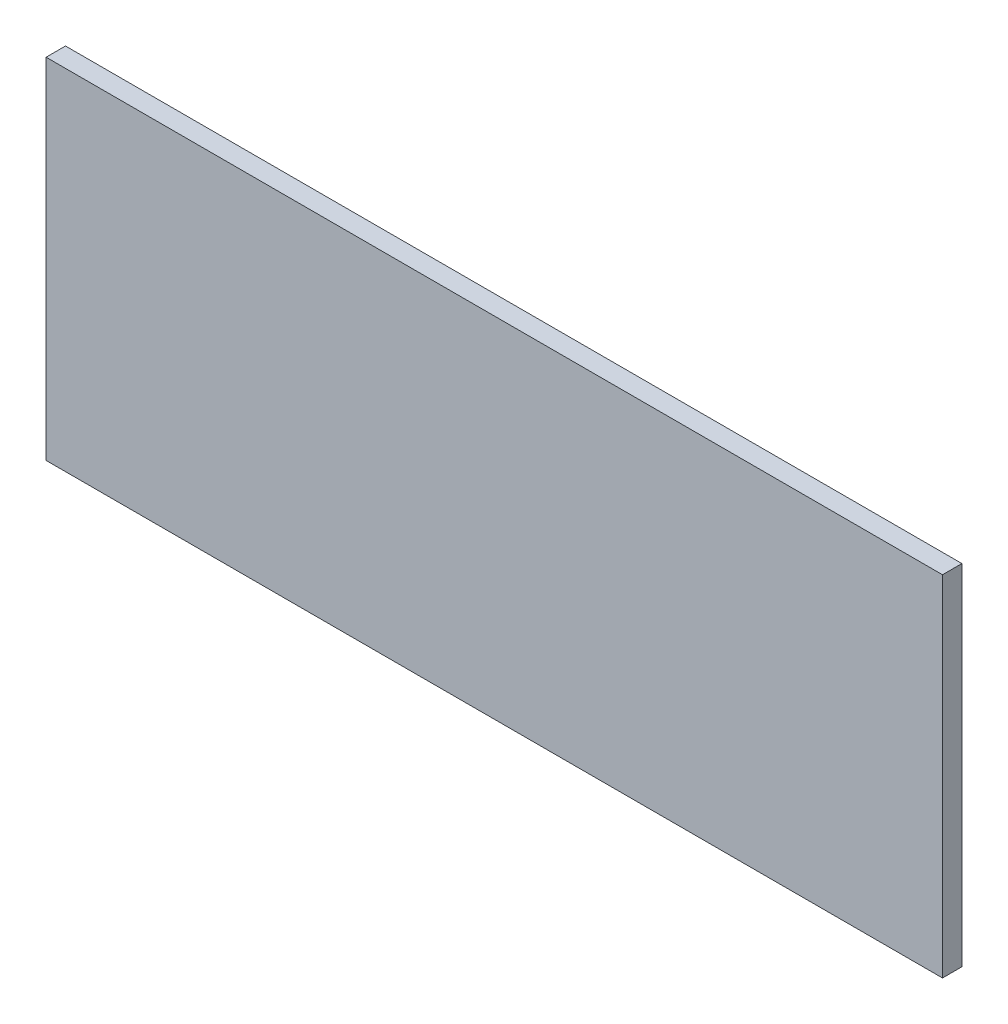
ISO-10303-21;
HEADER;
FILE_DESCRIPTION(('STEP AP214'),'2;1');
FILE_NAME('part.step','',(''),(''),'','','');
FILE_SCHEMA(('AUTOMOTIVE_DESIGN { 1 0 10303 214 1 1 1 1 }'));
ENDSEC;
DATA;
#1=APPLICATION_CONTEXT('core data for automotive mechanical design processes');
#2=APPLICATION_PROTOCOL_DEFINITION('international standard','automotive_design',2000,#1);
#3=PRODUCT_CONTEXT('',#1,'mechanical');
#4=PRODUCT('Part','Part','',(#3));
#5=PRODUCT_RELATED_PRODUCT_CATEGORY('part','',(#4));
#6=PRODUCT_DEFINITION_FORMATION('','',#4);
#7=PRODUCT_DEFINITION_CONTEXT('part definition',#1,'design');
#8=PRODUCT_DEFINITION('design','',#6,#7);
#9=PRODUCT_DEFINITION_SHAPE('','',#8);
#10=(LENGTH_UNIT() NAMED_UNIT(*) SI_UNIT(.MILLI.,.METRE.));
#11=(NAMED_UNIT(*) PLANE_ANGLE_UNIT() SI_UNIT($,.RADIAN.));
#12=(NAMED_UNIT(*) SI_UNIT($,.STERADIAN.) SOLID_ANGLE_UNIT());
#13=UNCERTAINTY_MEASURE_WITH_UNIT(LENGTH_MEASURE(1.E-05),#10,'distance_accuracy_value','');
#14=(GEOMETRIC_REPRESENTATION_CONTEXT(3) GLOBAL_UNCERTAINTY_ASSIGNED_CONTEXT((#13)) GLOBAL_UNIT_ASSIGNED_CONTEXT((#10,
#11,#12)) REPRESENTATION_CONTEXT('',''));
#15=CARTESIAN_POINT('',(0.,0.,0.));
#16=DIRECTION('',(0.,0.,1.));
#17=DIRECTION('',(1.,0.,0.));
#18=AXIS2_PLACEMENT_3D('',#15,#16,#17);
#19=CARTESIAN_POINT('',(115.5,-45.,5.));
#20=DIRECTION('',(-1.,0.,0.));
#21=DIRECTION('',(0.,0.,1.));
#22=AXIS2_PLACEMENT_3D('',#19,#20,#21);
#23=PLANE('',#22);
#24=DIRECTION('',(0.,1.,0.));
#25=VECTOR('',#24,1.);
#26=CARTESIAN_POINT('',(115.5,-45.,0.));
#27=LINE('',#26,#25);
#28=CARTESIAN_POINT('',(115.5,-45.,0.));
#29=VERTEX_POINT('',#28);
#30=CARTESIAN_POINT('',(115.5,45.,0.));
#31=VERTEX_POINT('',#30);
#32=EDGE_CURVE('E111',#29,#31,#27,.T.);
#33=ORIENTED_EDGE('',*,*,#32,.T.);
#34=DIRECTION('',(0.,0.,-1.));
#35=VECTOR('',#34,1.);
#36=CARTESIAN_POINT('',(115.5,45.,5.));
#37=LINE('',#36,#35);
#38=CARTESIAN_POINT('',(115.5,45.,5.));
#39=VERTEX_POINT('',#38);
#40=EDGE_CURVE('E11',#39,#31,#37,.T.);
#41=ORIENTED_EDGE('',*,*,#40,.F.);
#42=DIRECTION('',(0.,1.,0.));
#43=VECTOR('',#42,1.);
#44=CARTESIAN_POINT('',(115.5,-45.,5.));
#45=LINE('',#44,#43);
#46=CARTESIAN_POINT('',(115.5,-45.,5.));
#47=VERTEX_POINT('',#46);
#48=EDGE_CURVE('E95',#47,#39,#45,.T.);
#49=ORIENTED_EDGE('',*,*,#48,.F.);
#50=DIRECTION('',(0.,0.,-1.));
#51=VECTOR('',#50,1.);
#52=CARTESIAN_POINT('',(115.5,-45.,5.));
#53=LINE('',#52,#51);
#54=EDGE_CURVE('E107',#47,#29,#53,.T.);
#55=ORIENTED_EDGE('',*,*,#54,.T.);
#56=EDGE_LOOP('',(#33,#41,#49,#55));
#57=FACE_BOUND('',#56,.T.);
#58=ADVANCED_FACE('F43',(#57),#23,.F.);
#59=CARTESIAN_POINT('',(-115.5,45.,5.));
#60=DIRECTION('',(0.,-1.,0.));
#61=DIRECTION('',(0.,0.,-1.));
#62=AXIS2_PLACEMENT_3D('',#59,#60,#61);
#63=PLANE('',#62);
#64=DIRECTION('',(-1.,0.,0.));
#65=VECTOR('',#64,1.);
#66=CARTESIAN_POINT('',(-115.5,45.,0.));
#67=LINE('',#66,#65);
#68=CARTESIAN_POINT('',(-115.5,45.,0.));
#69=VERTEX_POINT('',#68);
#70=EDGE_CURVE('E100',#31,#69,#67,.T.);
#71=ORIENTED_EDGE('',*,*,#70,.T.);
#72=DIRECTION('',(0.,0.,-1.));
#73=VECTOR('',#72,1.);
#74=CARTESIAN_POINT('',(-115.5,45.,5.));
#75=LINE('',#74,#73);
#76=CARTESIAN_POINT('',(-115.5,45.,5.));
#77=VERTEX_POINT('',#76);
#78=EDGE_CURVE('E52',#77,#69,#75,.T.);
#79=ORIENTED_EDGE('',*,*,#78,.F.);
#80=DIRECTION('',(-1.,0.,0.));
#81=VECTOR('',#80,1.);
#82=CARTESIAN_POINT('',(-115.5,45.,5.));
#83=LINE('',#82,#81);
#84=EDGE_CURVE('E90',#39,#77,#83,.T.);
#85=ORIENTED_EDGE('',*,*,#84,.F.);
#86=ORIENTED_EDGE('',*,*,#40,.T.);
#87=EDGE_LOOP('',(#71,#79,#85,#86));
#88=FACE_BOUND('',#87,.T.);
#89=ADVANCED_FACE('F99',(#88),#63,.F.);
#90=CARTESIAN_POINT('',(-115.5,-45.,5.));
#91=DIRECTION('',(1.,0.,0.));
#92=DIRECTION('',(0.,0.,-1.));
#93=AXIS2_PLACEMENT_3D('',#90,#91,#92);
#94=PLANE('',#93);
#95=DIRECTION('',(0.,-1.,0.));
#96=VECTOR('',#95,1.);
#97=CARTESIAN_POINT('',(-115.5,-45.,0.));
#98=LINE('',#97,#96);
#99=CARTESIAN_POINT('',(-115.5,-45.,0.));
#100=VERTEX_POINT('',#99);
#101=EDGE_CURVE('E77',#69,#100,#98,.T.);
#102=ORIENTED_EDGE('',*,*,#101,.T.);
#103=DIRECTION('',(0.,0.,-1.));
#104=VECTOR('',#103,1.);
#105=CARTESIAN_POINT('',(-115.5,-45.,5.));
#106=LINE('',#105,#104);
#107=CARTESIAN_POINT('',(-115.5,-45.,5.));
#108=VERTEX_POINT('',#107);
#109=EDGE_CURVE('E102',#108,#100,#106,.T.);
#110=ORIENTED_EDGE('',*,*,#109,.F.);
#111=DIRECTION('',(0.,-1.,0.));
#112=VECTOR('',#111,1.);
#113=CARTESIAN_POINT('',(-115.5,-45.,5.));
#114=LINE('',#113,#112);
#115=EDGE_CURVE('E93',#77,#108,#114,.T.);
#116=ORIENTED_EDGE('',*,*,#115,.F.);
#117=ORIENTED_EDGE('',*,*,#78,.T.);
#118=EDGE_LOOP('',(#102,#110,#116,#117));
#119=FACE_BOUND('',#118,.T.);
#120=ADVANCED_FACE('F103',(#119),#94,.F.);
#121=CARTESIAN_POINT('',(-115.5,-45.,5.));
#122=DIRECTION('',(0.,1.,0.));
#123=DIRECTION('',(0.,0.,1.));
#124=AXIS2_PLACEMENT_3D('',#121,#122,#123);
#125=PLANE('',#124);
#126=DIRECTION('',(1.,0.,0.));
#127=VECTOR('',#126,1.);
#128=CARTESIAN_POINT('',(-115.5,-45.,0.));
#129=LINE('',#128,#127);
#130=EDGE_CURVE('E83',#100,#29,#129,.T.);
#131=ORIENTED_EDGE('',*,*,#130,.T.);
#132=ORIENTED_EDGE('',*,*,#54,.F.);
#133=DIRECTION('',(1.,0.,0.));
#134=VECTOR('',#133,1.);
#135=CARTESIAN_POINT('',(-115.5,-45.,5.));
#136=LINE('',#135,#134);
#137=EDGE_CURVE('E60',#108,#47,#136,.T.);
#138=ORIENTED_EDGE('',*,*,#137,.F.);
#139=ORIENTED_EDGE('',*,*,#109,.T.);
#140=EDGE_LOOP('',(#131,#132,#138,#139));
#141=FACE_BOUND('',#140,.T.);
#142=ADVANCED_FACE('F124',(#141),#125,.F.);
#143=CARTESIAN_POINT('',(0.,0.,5.));
#144=DIRECTION('',(0.,0.,-1.));
#145=DIRECTION('',(-1.,0.,0.));
#146=AXIS2_PLACEMENT_3D('',#143,#144,#145);
#147=PLANE('',#146);
#148=ORIENTED_EDGE('',*,*,#48,.T.);
#149=ORIENTED_EDGE('',*,*,#84,.T.);
#150=ORIENTED_EDGE('',*,*,#115,.T.);
#151=ORIENTED_EDGE('',*,*,#137,.T.);
#152=EDGE_LOOP('',(#148,#149,#150,#151));
#153=FACE_BOUND('',#152,.T.);
#154=ADVANCED_FACE('F91',(#153),#147,.F.);
#155=CARTESIAN_POINT('',(0.,0.,0.));
#156=DIRECTION('',(0.,0.,-1.));
#157=DIRECTION('',(-1.,0.,0.));
#158=AXIS2_PLACEMENT_3D('',#155,#156,#157);
#159=PLANE('',#158);
#160=ORIENTED_EDGE('',*,*,#32,.F.);
#161=ORIENTED_EDGE('',*,*,#130,.F.);
#162=ORIENTED_EDGE('',*,*,#101,.F.);
#163=ORIENTED_EDGE('',*,*,#70,.F.);
#164=EDGE_LOOP('',(#160,#161,#162,#163));
#165=FACE_BOUND('',#164,.T.);
#166=ADVANCED_FACE('F127',(#165),#159,.T.);
#167=CLOSED_SHELL('',(#58,#89,#120,#142,#154,#166));
#168=MANIFOLD_SOLID_BREP('B2',#167);
#169=ADVANCED_BREP_SHAPE_REPRESENTATION('',(#18,#168),#14);
#170=SHAPE_DEFINITION_REPRESENTATION(#9,#169);
ENDSEC;
END-ISO-10303-21;
